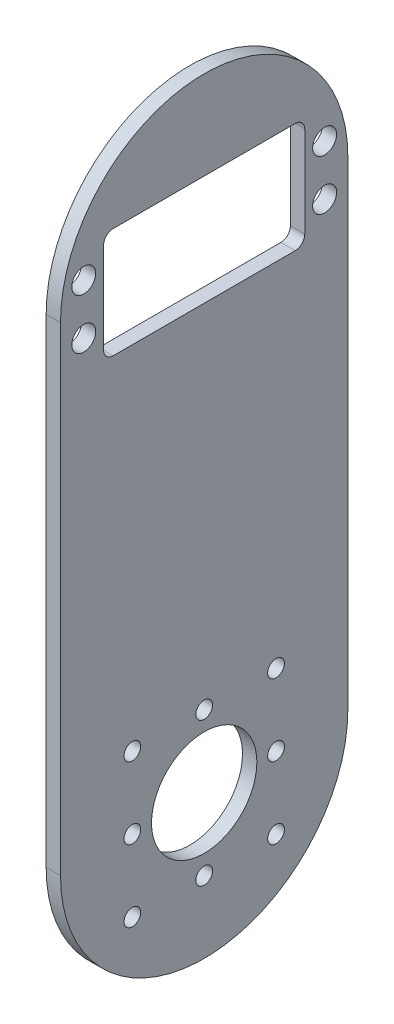
ISO-10303-21;
HEADER;
FILE_DESCRIPTION(('STEP AP214'),'2;1');
FILE_NAME('part.step','',(''),(''),'','','');
FILE_SCHEMA(('AUTOMOTIVE_DESIGN { 1 0 10303 214 1 1 1 1 }'));
ENDSEC;
DATA;
#1=APPLICATION_CONTEXT('core data for automotive mechanical design processes');
#2=APPLICATION_PROTOCOL_DEFINITION('international standard','automotive_design',2000,#1);
#3=PRODUCT_CONTEXT('',#1,'mechanical');
#4=PRODUCT('Part','Part','',(#3));
#5=PRODUCT_RELATED_PRODUCT_CATEGORY('part','',(#4));
#6=PRODUCT_DEFINITION_FORMATION('','',#4);
#7=PRODUCT_DEFINITION_CONTEXT('part definition',#1,'design');
#8=PRODUCT_DEFINITION('design','',#6,#7);
#9=PRODUCT_DEFINITION_SHAPE('','',#8);
#10=(LENGTH_UNIT() NAMED_UNIT(*) SI_UNIT(.MILLI.,.METRE.));
#11=(NAMED_UNIT(*) PLANE_ANGLE_UNIT() SI_UNIT($,.RADIAN.));
#12=(NAMED_UNIT(*) SI_UNIT($,.STERADIAN.) SOLID_ANGLE_UNIT());
#13=UNCERTAINTY_MEASURE_WITH_UNIT(LENGTH_MEASURE(1.E-05),#10,'distance_accuracy_value','');
#14=(GEOMETRIC_REPRESENTATION_CONTEXT(3) GLOBAL_UNCERTAINTY_ASSIGNED_CONTEXT((#13)) GLOBAL_UNIT_ASSIGNED_CONTEXT((#10,
#11,#12)) REPRESENTATION_CONTEXT('',''));
#15=CARTESIAN_POINT('',(0.,0.,0.));
#16=DIRECTION('',(0.,0.,1.));
#17=DIRECTION('',(1.,0.,0.));
#18=AXIS2_PLACEMENT_3D('',#15,#16,#17);
#19=CARTESIAN_POINT('',(3.,0.,-30.));
#20=DIRECTION('',(0.,0.,1.));
#21=DIRECTION('',(1.,0.,0.));
#22=AXIS2_PLACEMENT_3D('',#19,#20,#21);
#23=PLANE('',#22);
#24=DIRECTION('',(0.,1.,0.));
#25=VECTOR('',#24,1.);
#26=CARTESIAN_POINT('',(0.,0.,-30.));
#27=LINE('',#26,#25);
#28=CARTESIAN_POINT('',(0.,-50.,-30.));
#29=VERTEX_POINT('',#28);
#30=CARTESIAN_POINT('',(0.,50.,-29.9999999999999));
#31=VERTEX_POINT('',#30);
#32=EDGE_CURVE('E151',#29,#31,#27,.T.);
#33=ORIENTED_EDGE('',*,*,#32,.T.);
#34=DIRECTION('',(-1.,0.,0.));
#35=VECTOR('',#34,1.);
#36=CARTESIAN_POINT('',(3.00000000000002,50.,-29.9999999999999));
#37=LINE('',#36,#35);
#38=CARTESIAN_POINT('',(3.00000000000002,50.,-29.9999999999999));
#39=VERTEX_POINT('',#38);
#40=EDGE_CURVE('E132',#39,#31,#37,.T.);
#41=ORIENTED_EDGE('',*,*,#40,.F.);
#42=DIRECTION('',(0.,1.,0.));
#43=VECTOR('',#42,1.);
#44=CARTESIAN_POINT('',(3.,0.,-30.));
#45=LINE('',#44,#43);
#46=CARTESIAN_POINT('',(2.99999999999998,-50.,-30.));
#47=VERTEX_POINT('',#46);
#48=EDGE_CURVE('E139',#47,#39,#45,.T.);
#49=ORIENTED_EDGE('',*,*,#48,.F.);
#50=DIRECTION('',(-1.,0.,0.));
#51=VECTOR('',#50,1.);
#52=CARTESIAN_POINT('',(2.99999999999998,-50.,-30.));
#53=LINE('',#52,#51);
#54=EDGE_CURVE('E335',#47,#29,#53,.T.);
#55=ORIENTED_EDGE('',*,*,#54,.T.);
#56=EDGE_LOOP('',(#33,#41,#49,#55));
#57=FACE_BOUND('',#56,.T.);
#58=ADVANCED_FACE('F38',(#57),#23,.F.);
#59=CARTESIAN_POINT('',(3.,49.9999999999999,0.));
#60=DIRECTION('',(-1.,0.,0.));
#61=DIRECTION('',(0.,0.,1.));
#62=AXIS2_PLACEMENT_3D('',#59,#60,#61);
#63=CYLINDRICAL_SURFACE('',#62,30.);
#64=CARTESIAN_POINT('',(0.,50.,0.));
#65=DIRECTION('',(1.,0.,0.));
#66=DIRECTION('',(0.,0.,-1.));
#67=AXIS2_PLACEMENT_3D('',#64,#65,#66);
#68=CIRCLE('',#67,30.);
#69=CARTESIAN_POINT('',(0.,50.,30.));
#70=VERTEX_POINT('',#69);
#71=EDGE_CURVE('E337',#31,#70,#68,.T.);
#72=ORIENTED_EDGE('',*,*,#71,.T.);
#73=DIRECTION('',(-1.,0.,0.));
#74=VECTOR('',#73,1.);
#75=CARTESIAN_POINT('',(2.99999999999998,50.,30.0000000000001));
#76=LINE('',#75,#74);
#77=CARTESIAN_POINT('',(2.99999999999998,50.,30.0000000000001));
#78=VERTEX_POINT('',#77);
#79=EDGE_CURVE('E134',#78,#70,#76,.T.);
#80=ORIENTED_EDGE('',*,*,#79,.F.);
#81=CARTESIAN_POINT('',(3.,49.9999999999999,0.));
#82=DIRECTION('',(1.,0.,0.));
#83=DIRECTION('',(0.,0.,-1.));
#84=AXIS2_PLACEMENT_3D('',#81,#82,#83);
#85=CIRCLE('',#84,30.);
#86=EDGE_CURVE('E127',#39,#78,#85,.T.);
#87=ORIENTED_EDGE('',*,*,#86,.F.);
#88=ORIENTED_EDGE('',*,*,#40,.T.);
#89=EDGE_LOOP('',(#72,#80,#87,#88));
#90=FACE_BOUND('',#89,.T.);
#91=ADVANCED_FACE('F130',(#90),#63,.T.);
#92=CARTESIAN_POINT('',(3.,0.,30.));
#93=DIRECTION('',(0.,0.,1.));
#94=DIRECTION('',(1.,0.,0.));
#95=AXIS2_PLACEMENT_3D('',#92,#93,#94);
#96=PLANE('',#95);
#97=DIRECTION('',(0.,1.,0.));
#98=VECTOR('',#97,1.);
#99=CARTESIAN_POINT('',(0.,0.,30.));
#100=LINE('',#99,#98);
#101=CARTESIAN_POINT('',(0.,-50.,30.0000000000001));
#102=VERTEX_POINT('',#101);
#103=EDGE_CURVE('E339',#102,#70,#100,.T.);
#104=ORIENTED_EDGE('',*,*,#103,.F.);
#105=DIRECTION('',(-1.,0.,0.));
#106=VECTOR('',#105,1.);
#107=CARTESIAN_POINT('',(2.99999999999998,-50.,30.));
#108=LINE('',#107,#106);
#109=CARTESIAN_POINT('',(2.99999999999998,-50.,30.));
#110=VERTEX_POINT('',#109);
#111=EDGE_CURVE('E156',#110,#102,#108,.T.);
#112=ORIENTED_EDGE('',*,*,#111,.F.);
#113=DIRECTION('',(0.,1.,0.));
#114=VECTOR('',#113,1.);
#115=CARTESIAN_POINT('',(3.,0.,30.));
#116=LINE('',#115,#114);
#117=EDGE_CURVE('E138',#110,#78,#116,.T.);
#118=ORIENTED_EDGE('',*,*,#117,.T.);
#119=ORIENTED_EDGE('',*,*,#79,.T.);
#120=EDGE_LOOP('',(#104,#112,#118,#119));
#121=FACE_BOUND('',#120,.T.);
#122=ADVANCED_FACE('F220',(#121),#96,.T.);
#123=CARTESIAN_POINT('',(3.00000000000002,-50.,0.));
#124=DIRECTION('',(-1.,0.,0.));
#125=DIRECTION('',(0.,0.,1.));
#126=AXIS2_PLACEMENT_3D('',#123,#124,#125);
#127=CYLINDRICAL_SURFACE('',#126,30.);
#128=CARTESIAN_POINT('',(0.,-50.,0.));
#129=DIRECTION('',(1.,0.,0.));
#130=DIRECTION('',(0.,0.,-1.));
#131=AXIS2_PLACEMENT_3D('',#128,#129,#130);
#132=CIRCLE('',#131,30.);
#133=EDGE_CURVE('E148',#102,#29,#132,.T.);
#134=ORIENTED_EDGE('',*,*,#133,.T.);
#135=ORIENTED_EDGE('',*,*,#54,.F.);
#136=CARTESIAN_POINT('',(3.00000000000002,-50.,0.));
#137=DIRECTION('',(1.,0.,0.));
#138=DIRECTION('',(0.,0.,-1.));
#139=AXIS2_PLACEMENT_3D('',#136,#137,#138);
#140=CIRCLE('',#139,30.);
#141=EDGE_CURVE('E144',#110,#47,#140,.T.);
#142=ORIENTED_EDGE('',*,*,#141,.F.);
#143=ORIENTED_EDGE('',*,*,#111,.T.);
#144=EDGE_LOOP('',(#134,#135,#142,#143));
#145=FACE_BOUND('',#144,.T.);
#146=ADVANCED_FACE('F345',(#145),#127,.T.);
#147=CARTESIAN_POINT('',(3.,0.,0.));
#148=DIRECTION('',(1.,0.,0.));
#149=DIRECTION('',(0.,0.,-1.));
#150=AXIS2_PLACEMENT_3D('',#147,#148,#149);
#151=PLANE('',#150);
#152=CARTESIAN_POINT('',(2.99999999999999,55.25,25.1500000000001));
#153=DIRECTION('',(1.,0.,0.));
#154=DIRECTION('',(0.,0.,-1.));
#155=AXIS2_PLACEMENT_3D('',#152,#153,#154);
#156=CIRCLE('',#155,2.5);
#157=CARTESIAN_POINT('',(2.99999999999999,55.25,22.6500000000001));
#158=VERTEX_POINT('',#157);
#159=EDGE_CURVE('E267',#158,#158,#156,.T.);
#160=ORIENTED_EDGE('',*,*,#159,.F.);
#161=EDGE_LOOP('',(#160));
#162=FACE_BOUND('',#161,.T.);
#163=CARTESIAN_POINT('',(3.,44.7499999999999,25.15));
#164=DIRECTION('',(1.,0.,0.));
#165=DIRECTION('',(0.,0.,-1.));
#166=AXIS2_PLACEMENT_3D('',#163,#164,#165);
#167=CIRCLE('',#166,2.5);
#168=CARTESIAN_POINT('',(3.,44.7499999999999,22.65));
#169=VERTEX_POINT('',#168);
#170=EDGE_CURVE('E261',#169,#169,#167,.T.);
#171=ORIENTED_EDGE('',*,*,#170,.F.);
#172=EDGE_LOOP('',(#171));
#173=FACE_BOUND('',#172,.T.);
#174=DIRECTION('',(0.,-1.,0.));
#175=VECTOR('',#174,1.);
#176=CARTESIAN_POINT('',(3.00000000000003,38.4999999999999,21.));
#177=LINE('',#176,#175);
#178=CARTESIAN_POINT('',(3.,59.4999999999999,21.));
#179=VERTEX_POINT('',#178);
#180=CARTESIAN_POINT('',(3.,40.4999999999999,21.));
#181=VERTEX_POINT('',#180);
#182=EDGE_CURVE('E246',#179,#181,#177,.T.);
#183=ORIENTED_EDGE('',*,*,#182,.F.);
#184=CARTESIAN_POINT('',(3.00000000000004,59.5000000000001,19.0000000000001));
#185=DIRECTION('',(1.,0.,0.));
#186=DIRECTION('',(0.,0.,-1.));
#187=AXIS2_PLACEMENT_3D('',#184,#185,#186);
#188=CIRCLE('',#187,2.);
#189=CARTESIAN_POINT('',(2.99999999999999,61.4999999999999,19.));
#190=VERTEX_POINT('',#189);
#191=EDGE_CURVE('E176',#179,#190,#188,.F.);
#192=ORIENTED_EDGE('',*,*,#191,.T.);
#193=DIRECTION('',(0.,0.,1.));
#194=VECTOR('',#193,1.);
#195=CARTESIAN_POINT('',(3.,61.4999999999999,-21.));
#196=LINE('',#195,#194);
#197=CARTESIAN_POINT('',(3.,61.4999999999999,-19.));
#198=VERTEX_POINT('',#197);
#199=EDGE_CURVE('E256',#198,#190,#196,.T.);
#200=ORIENTED_EDGE('',*,*,#199,.F.);
#201=CARTESIAN_POINT('',(2.99999999999998,59.4999999999999,-19.));
#202=DIRECTION('',(1.,0.,0.));
#203=DIRECTION('',(0.,0.,-1.));
#204=AXIS2_PLACEMENT_3D('',#201,#202,#203);
#205=CIRCLE('',#204,2.);
#206=CARTESIAN_POINT('',(3.,59.4999999999999,-21.));
#207=VERTEX_POINT('',#206);
#208=EDGE_CURVE('E46',#198,#207,#205,.F.);
#209=ORIENTED_EDGE('',*,*,#208,.T.);
#210=DIRECTION('',(0.,1.,0.));
#211=VECTOR('',#210,1.);
#212=CARTESIAN_POINT('',(3.,38.5,-21.));
#213=LINE('',#212,#211);
#214=CARTESIAN_POINT('',(3.,40.4999999999999,-21.));
#215=VERTEX_POINT('',#214);
#216=EDGE_CURVE('E254',#215,#207,#213,.T.);
#217=ORIENTED_EDGE('',*,*,#216,.F.);
#218=CARTESIAN_POINT('',(3.,40.4999999999999,-19.));
#219=DIRECTION('',(1.,0.,0.));
#220=DIRECTION('',(0.,0.,-1.));
#221=AXIS2_PLACEMENT_3D('',#218,#219,#220);
#222=CIRCLE('',#221,2.);
#223=CARTESIAN_POINT('',(2.99999999999999,38.5,-19.));
#224=VERTEX_POINT('',#223);
#225=EDGE_CURVE('E60',#215,#224,#222,.F.);
#226=ORIENTED_EDGE('',*,*,#225,.T.);
#227=DIRECTION('',(0.,0.,-1.));
#228=VECTOR('',#227,1.);
#229=CARTESIAN_POINT('',(3.,38.5,-21.));
#230=LINE('',#229,#228);
#231=CARTESIAN_POINT('',(3.00000000000004,38.5,19.));
#232=VERTEX_POINT('',#231);
#233=EDGE_CURVE('E248',#232,#224,#230,.T.);
#234=ORIENTED_EDGE('',*,*,#233,.F.);
#235=CARTESIAN_POINT('',(3.00000000000003,40.5,19.));
#236=DIRECTION('',(1.,0.,0.));
#237=DIRECTION('',(0.,0.,-1.));
#238=AXIS2_PLACEMENT_3D('',#235,#236,#237);
#239=CIRCLE('',#238,2.);
#240=EDGE_CURVE('E180',#232,#181,#239,.F.);
#241=ORIENTED_EDGE('',*,*,#240,.T.);
#242=EDGE_LOOP('',(#183,#192,#200,#209,#217,#226,#234,#241));
#243=FACE_BOUND('',#242,.T.);
#244=CARTESIAN_POINT('',(3.00000000000002,44.75,-25.1499999999999));
#245=DIRECTION('',(1.,0.,0.));
#246=DIRECTION('',(0.,0.,-1.));
#247=AXIS2_PLACEMENT_3D('',#244,#245,#246);
#248=CIRCLE('',#247,2.5);
#249=CARTESIAN_POINT('',(3.00000000000002,44.75,-27.6499999999999));
#250=VERTEX_POINT('',#249);
#251=EDGE_CURVE('E260',#250,#250,#248,.T.);
#252=ORIENTED_EDGE('',*,*,#251,.F.);
#253=EDGE_LOOP('',(#252));
#254=FACE_BOUND('',#253,.T.);
#255=CARTESIAN_POINT('',(3.00000000000003,55.25,-25.15));
#256=DIRECTION('',(1.,0.,0.));
#257=DIRECTION('',(0.,0.,-1.));
#258=AXIS2_PLACEMENT_3D('',#255,#256,#257);
#259=CIRCLE('',#258,2.5);
#260=CARTESIAN_POINT('',(3.00000000000003,55.25,-27.65));
#261=VERTEX_POINT('',#260);
#262=EDGE_CURVE('E272',#261,#261,#259,.T.);
#263=ORIENTED_EDGE('',*,*,#262,.F.);
#264=EDGE_LOOP('',(#263));
#265=FACE_BOUND('',#264,.T.);
#266=CARTESIAN_POINT('',(2.99999999999999,-35.,0.));
#267=DIRECTION('',(1.,0.,0.));
#268=DIRECTION('',(0.,0.,-1.));
#269=AXIS2_PLACEMENT_3D('',#266,#267,#268);
#270=CIRCLE('',#269,1.75);
#271=CARTESIAN_POINT('',(2.99999999999999,-35.,-1.74999999999999));
#272=VERTEX_POINT('',#271);
#273=EDGE_CURVE('E307',#272,#272,#270,.T.);
#274=ORIENTED_EDGE('',*,*,#273,.F.);
#275=EDGE_LOOP('',(#274));
#276=FACE_BOUND('',#275,.T.);
#277=CARTESIAN_POINT('',(3.,-35.0000000000001,15.));
#278=DIRECTION('',(1.,0.,0.));
#279=DIRECTION('',(0.,0.,-1.));
#280=AXIS2_PLACEMENT_3D('',#277,#278,#279);
#281=CIRCLE('',#280,1.75);
#282=CARTESIAN_POINT('',(3.,-35.0000000000001,13.25));
#283=VERTEX_POINT('',#282);
#284=EDGE_CURVE('E308',#283,#283,#281,.T.);
#285=ORIENTED_EDGE('',*,*,#284,.F.);
#286=EDGE_LOOP('',(#285));
#287=FACE_BOUND('',#286,.T.);
#288=CARTESIAN_POINT('',(3.,-50.,-14.9999999999999));
#289=DIRECTION('',(1.,0.,0.));
#290=DIRECTION('',(0.,0.,-1.));
#291=AXIS2_PLACEMENT_3D('',#288,#289,#290);
#292=CIRCLE('',#291,1.75);
#293=CARTESIAN_POINT('',(3.,-50.,-16.7499999999999));
#294=VERTEX_POINT('',#293);
#295=EDGE_CURVE('E315',#294,#294,#292,.T.);
#296=ORIENTED_EDGE('',*,*,#295,.F.);
#297=EDGE_LOOP('',(#296));
#298=FACE_BOUND('',#297,.T.);
#299=CARTESIAN_POINT('',(3.00000000000003,-65.,0.));
#300=DIRECTION('',(1.,0.,0.));
#301=DIRECTION('',(0.,0.,-1.));
#302=AXIS2_PLACEMENT_3D('',#299,#300,#301);
#303=CIRCLE('',#302,1.75);
#304=CARTESIAN_POINT('',(3.00000000000003,-65.,-1.74999999999997));
#305=VERTEX_POINT('',#304);
#306=EDGE_CURVE('E321',#305,#305,#303,.T.);
#307=ORIENTED_EDGE('',*,*,#306,.F.);
#308=EDGE_LOOP('',(#307));
#309=FACE_BOUND('',#308,.T.);
#310=CARTESIAN_POINT('',(3.00000000000002,-50.,14.9999999999999));
#311=DIRECTION('',(1.,0.,0.));
#312=DIRECTION('',(0.,0.,-1.));
#313=AXIS2_PLACEMENT_3D('',#310,#311,#312);
#314=CIRCLE('',#313,1.75);
#315=CARTESIAN_POINT('',(3.00000000000002,-50.,13.2499999999999));
#316=VERTEX_POINT('',#315);
#317=EDGE_CURVE('E283',#316,#316,#314,.T.);
#318=ORIENTED_EDGE('',*,*,#317,.F.);
#319=EDGE_LOOP('',(#318));
#320=FACE_BOUND('',#319,.T.);
#321=CARTESIAN_POINT('',(3.00000000000002,-65.,15.));
#322=DIRECTION('',(1.,0.,0.));
#323=DIRECTION('',(0.,0.,-1.));
#324=AXIS2_PLACEMENT_3D('',#321,#322,#323);
#325=CIRCLE('',#324,1.75);
#326=CARTESIAN_POINT('',(3.00000000000002,-65.,13.25));
#327=VERTEX_POINT('',#326);
#328=EDGE_CURVE('E284',#327,#327,#325,.T.);
#329=ORIENTED_EDGE('',*,*,#328,.F.);
#330=EDGE_LOOP('',(#329));
#331=FACE_BOUND('',#330,.T.);
#332=CARTESIAN_POINT('',(2.99999999999998,-65.,-15.));
#333=DIRECTION('',(1.,0.,0.));
#334=DIRECTION('',(0.,0.,-1.));
#335=AXIS2_PLACEMENT_3D('',#332,#333,#334);
#336=CIRCLE('',#335,1.75);
#337=CARTESIAN_POINT('',(2.99999999999998,-65.,-16.75));
#338=VERTEX_POINT('',#337);
#339=EDGE_CURVE('E291',#338,#338,#336,.T.);
#340=ORIENTED_EDGE('',*,*,#339,.F.);
#341=EDGE_LOOP('',(#340));
#342=FACE_BOUND('',#341,.T.);
#343=CARTESIAN_POINT('',(3.00000000000002,-50.,0.));
#344=DIRECTION('',(1.,0.,0.));
#345=DIRECTION('',(0.,0.,-1.));
#346=AXIS2_PLACEMENT_3D('',#343,#344,#345);
#347=CIRCLE('',#346,11.);
#348=CARTESIAN_POINT('',(3.00000000000002,-50.,-11.));
#349=VERTEX_POINT('',#348);
#350=EDGE_CURVE('E297',#349,#349,#347,.T.);
#351=ORIENTED_EDGE('',*,*,#350,.F.);
#352=EDGE_LOOP('',(#351));
#353=FACE_BOUND('',#352,.T.);
#354=CARTESIAN_POINT('',(3.,-35.,-15.));
#355=DIRECTION('',(1.,0.,0.));
#356=DIRECTION('',(0.,0.,-1.));
#357=AXIS2_PLACEMENT_3D('',#354,#355,#356);
#358=CIRCLE('',#357,1.75);
#359=CARTESIAN_POINT('',(3.,-35.,-16.75));
#360=VERTEX_POINT('',#359);
#361=EDGE_CURVE('E311',#360,#360,#358,.T.);
#362=ORIENTED_EDGE('',*,*,#361,.F.);
#363=EDGE_LOOP('',(#362));
#364=FACE_BOUND('',#363,.T.);
#365=ORIENTED_EDGE('',*,*,#48,.T.);
#366=ORIENTED_EDGE('',*,*,#86,.T.);
#367=ORIENTED_EDGE('',*,*,#117,.F.);
#368=ORIENTED_EDGE('',*,*,#141,.T.);
#369=EDGE_LOOP('',(#365,#366,#367,#368));
#370=FACE_BOUND('',#369,.T.);
#371=ADVANCED_FACE('F142',(#162,#173,#243,#254,#265,#276,#287,#298,#309,#320,#331,#342,#353,
#364,#370),#151,.T.);
#372=CARTESIAN_POINT('',(0.,0.,0.));
#373=DIRECTION('',(1.,0.,0.));
#374=DIRECTION('',(0.,0.,-1.));
#375=AXIS2_PLACEMENT_3D('',#372,#373,#374);
#376=PLANE('',#375);
#377=CARTESIAN_POINT('',(0.,55.25,25.1500000000001));
#378=DIRECTION('',(1.,0.,0.));
#379=DIRECTION('',(0.,0.,-1.));
#380=AXIS2_PLACEMENT_3D('',#377,#378,#379);
#381=CIRCLE('',#380,2.5);
#382=CARTESIAN_POINT('',(0.,55.25,22.6500000000001));
#383=VERTEX_POINT('',#382);
#384=EDGE_CURVE('E264',#383,#383,#381,.F.);
#385=ORIENTED_EDGE('',*,*,#384,.F.);
#386=EDGE_LOOP('',(#385));
#387=FACE_BOUND('',#386,.T.);
#388=CARTESIAN_POINT('',(0.,44.75,25.15));
#389=DIRECTION('',(1.,0.,0.));
#390=DIRECTION('',(0.,0.,-1.));
#391=AXIS2_PLACEMENT_3D('',#388,#389,#390);
#392=CIRCLE('',#391,2.5);
#393=CARTESIAN_POINT('',(0.,44.75,22.65));
#394=VERTEX_POINT('',#393);
#395=EDGE_CURVE('E202',#394,#394,#392,.F.);
#396=ORIENTED_EDGE('',*,*,#395,.F.);
#397=EDGE_LOOP('',(#396));
#398=FACE_BOUND('',#397,.T.);
#399=DIRECTION('',(0.,0.,-1.));
#400=VECTOR('',#399,1.);
#401=CARTESIAN_POINT('',(0.,61.5,-21.));
#402=LINE('',#401,#400);
#403=CARTESIAN_POINT('',(0.,61.4999999999999,19.));
#404=VERTEX_POINT('',#403);
#405=CARTESIAN_POINT('',(0.,61.4999999999999,-19.));
#406=VERTEX_POINT('',#405);
#407=EDGE_CURVE('E201',#404,#406,#402,.T.);
#408=ORIENTED_EDGE('',*,*,#407,.F.);
#409=CARTESIAN_POINT('',(0.,59.5,19.));
#410=DIRECTION('',(1.,0.,0.));
#411=DIRECTION('',(0.,0.,-1.));
#412=AXIS2_PLACEMENT_3D('',#409,#410,#411);
#413=CIRCLE('',#412,2.);
#414=CARTESIAN_POINT('',(0.,59.5,21.));
#415=VERTEX_POINT('',#414);
#416=EDGE_CURVE('E178',#404,#415,#413,.T.);
#417=ORIENTED_EDGE('',*,*,#416,.T.);
#418=DIRECTION('',(0.,1.,0.));
#419=VECTOR('',#418,1.);
#420=CARTESIAN_POINT('',(0.,38.5,21.));
#421=LINE('',#420,#419);
#422=CARTESIAN_POINT('',(0.,40.4999999999999,21.));
#423=VERTEX_POINT('',#422);
#424=EDGE_CURVE('E238',#423,#415,#421,.T.);
#425=ORIENTED_EDGE('',*,*,#424,.F.);
#426=CARTESIAN_POINT('',(0.,40.4999999999999,19.));
#427=DIRECTION('',(1.,0.,0.));
#428=DIRECTION('',(0.,0.,-1.));
#429=AXIS2_PLACEMENT_3D('',#426,#427,#428);
#430=CIRCLE('',#429,2.);
#431=CARTESIAN_POINT('',(0.,38.5,19.));
#432=VERTEX_POINT('',#431);
#433=EDGE_CURVE('E182',#423,#432,#430,.T.);
#434=ORIENTED_EDGE('',*,*,#433,.T.);
#435=DIRECTION('',(0.,0.,1.));
#436=VECTOR('',#435,1.);
#437=CARTESIAN_POINT('',(0.,38.5,-21.));
#438=LINE('',#437,#436);
#439=CARTESIAN_POINT('',(0.,38.5,-19.));
#440=VERTEX_POINT('',#439);
#441=EDGE_CURVE('E197',#440,#432,#438,.T.);
#442=ORIENTED_EDGE('',*,*,#441,.F.);
#443=CARTESIAN_POINT('',(0.,40.4999999999999,-19.));
#444=DIRECTION('',(1.,0.,0.));
#445=DIRECTION('',(0.,0.,-1.));
#446=AXIS2_PLACEMENT_3D('',#443,#444,#445);
#447=CIRCLE('',#446,2.);
#448=CARTESIAN_POINT('',(0.,40.4999999999999,-21.));
#449=VERTEX_POINT('',#448);
#450=EDGE_CURVE('E185',#440,#449,#447,.T.);
#451=ORIENTED_EDGE('',*,*,#450,.T.);
#452=DIRECTION('',(0.,-1.,0.));
#453=VECTOR('',#452,1.);
#454=CARTESIAN_POINT('',(0.,38.5,-21.));
#455=LINE('',#454,#453);
#456=CARTESIAN_POINT('',(0.,59.4999999999999,-21.));
#457=VERTEX_POINT('',#456);
#458=EDGE_CURVE('E194',#457,#449,#455,.T.);
#459=ORIENTED_EDGE('',*,*,#458,.F.);
#460=CARTESIAN_POINT('',(0.,59.4999999999999,-18.9999999999999));
#461=DIRECTION('',(1.,0.,0.));
#462=DIRECTION('',(0.,0.,-1.));
#463=AXIS2_PLACEMENT_3D('',#460,#461,#462);
#464=CIRCLE('',#463,2.);
#465=EDGE_CURVE('E11',#457,#406,#464,.T.);
#466=ORIENTED_EDGE('',*,*,#465,.T.);
#467=EDGE_LOOP('',(#408,#417,#425,#434,#442,#451,#459,#466));
#468=FACE_BOUND('',#467,.T.);
#469=CARTESIAN_POINT('',(0.,44.7499999999999,-25.15));
#470=DIRECTION('',(1.,0.,0.));
#471=DIRECTION('',(0.,0.,-1.));
#472=AXIS2_PLACEMENT_3D('',#469,#470,#471);
#473=CIRCLE('',#472,2.5);
#474=CARTESIAN_POINT('',(0.,44.7499999999999,-27.65));
#475=VERTEX_POINT('',#474);
#476=EDGE_CURVE('E276',#475,#475,#473,.F.);
#477=ORIENTED_EDGE('',*,*,#476,.F.);
#478=EDGE_LOOP('',(#477));
#479=FACE_BOUND('',#478,.T.);
#480=CARTESIAN_POINT('',(0.,55.25,-25.15));
#481=DIRECTION('',(1.,0.,0.));
#482=DIRECTION('',(0.,0.,-1.));
#483=AXIS2_PLACEMENT_3D('',#480,#481,#482);
#484=CIRCLE('',#483,2.5);
#485=CARTESIAN_POINT('',(0.,55.25,-27.65));
#486=VERTEX_POINT('',#485);
#487=EDGE_CURVE('E275',#486,#486,#484,.F.);
#488=ORIENTED_EDGE('',*,*,#487,.F.);
#489=EDGE_LOOP('',(#488));
#490=FACE_BOUND('',#489,.T.);
#491=CARTESIAN_POINT('',(0.,-35.,0.));
#492=DIRECTION('',(1.,0.,0.));
#493=DIRECTION('',(0.,0.,-1.));
#494=AXIS2_PLACEMENT_3D('',#491,#492,#493);
#495=CIRCLE('',#494,1.75);
#496=CARTESIAN_POINT('',(0.,-35.,-1.74999999999996));
#497=VERTEX_POINT('',#496);
#498=EDGE_CURVE('E304',#497,#497,#495,.F.);
#499=ORIENTED_EDGE('',*,*,#498,.F.);
#500=EDGE_LOOP('',(#499));
#501=FACE_BOUND('',#500,.T.);
#502=CARTESIAN_POINT('',(0.,-35.,15.));
#503=DIRECTION('',(1.,0.,0.));
#504=DIRECTION('',(0.,0.,-1.));
#505=AXIS2_PLACEMENT_3D('',#502,#503,#504);
#506=CIRCLE('',#505,1.75);
#507=CARTESIAN_POINT('',(0.,-35.,13.25));
#508=VERTEX_POINT('',#507);
#509=EDGE_CURVE('E312',#508,#508,#506,.F.);
#510=ORIENTED_EDGE('',*,*,#509,.F.);
#511=EDGE_LOOP('',(#510));
#512=FACE_BOUND('',#511,.T.);
#513=CARTESIAN_POINT('',(0.,-50.,-14.9999999999999));
#514=DIRECTION('',(1.,0.,0.));
#515=DIRECTION('',(0.,0.,-1.));
#516=AXIS2_PLACEMENT_3D('',#513,#514,#515);
#517=CIRCLE('',#516,1.75);
#518=CARTESIAN_POINT('',(0.,-50.,-16.7499999999999));
#519=VERTEX_POINT('',#518);
#520=EDGE_CURVE('E318',#519,#519,#517,.F.);
#521=ORIENTED_EDGE('',*,*,#520,.F.);
#522=EDGE_LOOP('',(#521));
#523=FACE_BOUND('',#522,.T.);
#524=CARTESIAN_POINT('',(0.,-65.,0.));
#525=DIRECTION('',(1.,0.,0.));
#526=DIRECTION('',(0.,0.,-1.));
#527=AXIS2_PLACEMENT_3D('',#524,#525,#526);
#528=CIRCLE('',#527,1.75);
#529=CARTESIAN_POINT('',(0.,-65.,-1.74999999999997));
#530=VERTEX_POINT('',#529);
#531=EDGE_CURVE('E287',#530,#530,#528,.F.);
#532=ORIENTED_EDGE('',*,*,#531,.F.);
#533=EDGE_LOOP('',(#532));
#534=FACE_BOUND('',#533,.T.);
#535=CARTESIAN_POINT('',(0.,-50.,15.));
#536=DIRECTION('',(1.,0.,0.));
#537=DIRECTION('',(0.,0.,-1.));
#538=AXIS2_PLACEMENT_3D('',#535,#536,#537);
#539=CIRCLE('',#538,1.75);
#540=CARTESIAN_POINT('',(0.,-50.,13.25));
#541=VERTEX_POINT('',#540);
#542=EDGE_CURVE('E280',#541,#541,#539,.F.);
#543=ORIENTED_EDGE('',*,*,#542,.F.);
#544=EDGE_LOOP('',(#543));
#545=FACE_BOUND('',#544,.T.);
#546=CARTESIAN_POINT('',(0.,-65.,14.9999999999999));
#547=DIRECTION('',(1.,0.,0.));
#548=DIRECTION('',(0.,0.,-1.));
#549=AXIS2_PLACEMENT_3D('',#546,#547,#548);
#550=CIRCLE('',#549,1.75);
#551=CARTESIAN_POINT('',(0.,-65.,13.2499999999999));
#552=VERTEX_POINT('',#551);
#553=EDGE_CURVE('E288',#552,#552,#550,.F.);
#554=ORIENTED_EDGE('',*,*,#553,.F.);
#555=EDGE_LOOP('',(#554));
#556=FACE_BOUND('',#555,.T.);
#557=CARTESIAN_POINT('',(0.,-65.,-15.));
#558=DIRECTION('',(1.,0.,0.));
#559=DIRECTION('',(0.,0.,-1.));
#560=AXIS2_PLACEMENT_3D('',#557,#558,#559);
#561=CIRCLE('',#560,1.75);
#562=CARTESIAN_POINT('',(0.,-65.,-16.75));
#563=VERTEX_POINT('',#562);
#564=EDGE_CURVE('E294',#563,#563,#561,.F.);
#565=ORIENTED_EDGE('',*,*,#564,.F.);
#566=EDGE_LOOP('',(#565));
#567=FACE_BOUND('',#566,.T.);
#568=CARTESIAN_POINT('',(0.,-50.,0.));
#569=DIRECTION('',(1.,0.,0.));
#570=DIRECTION('',(0.,0.,-1.));
#571=AXIS2_PLACEMENT_3D('',#568,#569,#570);
#572=CIRCLE('',#571,11.);
#573=CARTESIAN_POINT('',(0.,-50.,-11.));
#574=VERTEX_POINT('',#573);
#575=EDGE_CURVE('E279',#574,#574,#572,.F.);
#576=ORIENTED_EDGE('',*,*,#575,.F.);
#577=EDGE_LOOP('',(#576));
#578=FACE_BOUND('',#577,.T.);
#579=CARTESIAN_POINT('',(0.,-35.,-14.9999999999999));
#580=DIRECTION('',(1.,0.,0.));
#581=DIRECTION('',(0.,0.,-1.));
#582=AXIS2_PLACEMENT_3D('',#579,#580,#581);
#583=CIRCLE('',#582,1.75);
#584=CARTESIAN_POINT('',(0.,-35.,-16.7499999999999));
#585=VERTEX_POINT('',#584);
#586=EDGE_CURVE('E330',#585,#585,#583,.F.);
#587=ORIENTED_EDGE('',*,*,#586,.F.);
#588=EDGE_LOOP('',(#587));
#589=FACE_BOUND('',#588,.T.);
#590=ORIENTED_EDGE('',*,*,#32,.F.);
#591=ORIENTED_EDGE('',*,*,#133,.F.);
#592=ORIENTED_EDGE('',*,*,#103,.T.);
#593=ORIENTED_EDGE('',*,*,#71,.F.);
#594=EDGE_LOOP('',(#590,#591,#592,#593));
#595=FACE_BOUND('',#594,.T.);
#596=ADVANCED_FACE('F192',(#387,#398,#468,#479,#490,#501,#512,#523,#534,#545,#556,#567,#578,
#589,#595),#376,.F.);
#597=CARTESIAN_POINT('',(-0.00100000000001488,-35.,-15.));
#598=DIRECTION('',(1.,0.,0.));
#599=DIRECTION('',(0.,0.,-1.));
#600=AXIS2_PLACEMENT_3D('',#597,#598,#599);
#601=CYLINDRICAL_SURFACE('',#600,1.75);
#602=ORIENTED_EDGE('',*,*,#361,.T.);
#603=EDGE_LOOP('',(#602));
#604=FACE_BOUND('',#603,.T.);
#605=ORIENTED_EDGE('',*,*,#586,.T.);
#606=EDGE_LOOP('',(#605));
#607=FACE_BOUND('',#606,.T.);
#608=ADVANCED_FACE('F357',(#604,#607),#601,.F.);
#609=CARTESIAN_POINT('',(-0.000999999999987122,-50.,0.));
#610=DIRECTION('',(1.,0.,0.));
#611=DIRECTION('',(0.,0.,-1.));
#612=AXIS2_PLACEMENT_3D('',#609,#610,#611);
#613=CYLINDRICAL_SURFACE('',#612,11.);
#614=ORIENTED_EDGE('',*,*,#350,.T.);
#615=EDGE_LOOP('',(#614));
#616=FACE_BOUND('',#615,.T.);
#617=ORIENTED_EDGE('',*,*,#575,.T.);
#618=EDGE_LOOP('',(#617));
#619=FACE_BOUND('',#618,.T.);
#620=ADVANCED_FACE('F364',(#616,#619),#613,.F.);
#621=CARTESIAN_POINT('',(-0.00100000000001488,-65.,-15.));
#622=DIRECTION('',(1.,0.,0.));
#623=DIRECTION('',(0.,0.,-1.));
#624=AXIS2_PLACEMENT_3D('',#621,#622,#623);
#625=CYLINDRICAL_SURFACE('',#624,1.75);
#626=ORIENTED_EDGE('',*,*,#339,.T.);
#627=EDGE_LOOP('',(#626));
#628=FACE_BOUND('',#627,.T.);
#629=ORIENTED_EDGE('',*,*,#564,.T.);
#630=EDGE_LOOP('',(#629));
#631=FACE_BOUND('',#630,.T.);
#632=ADVANCED_FACE('F386',(#628,#631),#625,.F.);
#633=CARTESIAN_POINT('',(-0.000999999999973245,-65.,15.));
#634=DIRECTION('',(1.,0.,0.));
#635=DIRECTION('',(0.,0.,-1.));
#636=AXIS2_PLACEMENT_3D('',#633,#634,#635);
#637=CYLINDRICAL_SURFACE('',#636,1.75);
#638=ORIENTED_EDGE('',*,*,#328,.T.);
#639=EDGE_LOOP('',(#638));
#640=FACE_BOUND('',#639,.T.);
#641=ORIENTED_EDGE('',*,*,#553,.T.);
#642=EDGE_LOOP('',(#641));
#643=FACE_BOUND('',#642,.T.);
#644=ADVANCED_FACE('F390',(#640,#643),#637,.F.);
#645=CARTESIAN_POINT('',(-0.000999999999987122,-50.,15.));
#646=DIRECTION('',(1.,0.,0.));
#647=DIRECTION('',(0.,0.,-1.));
#648=AXIS2_PLACEMENT_3D('',#645,#646,#647);
#649=CYLINDRICAL_SURFACE('',#648,1.75);
#650=ORIENTED_EDGE('',*,*,#317,.T.);
#651=EDGE_LOOP('',(#650));
#652=FACE_BOUND('',#651,.T.);
#653=ORIENTED_EDGE('',*,*,#542,.T.);
#654=EDGE_LOOP('',(#653));
#655=FACE_BOUND('',#654,.T.);
#656=ADVANCED_FACE('F370',(#652,#655),#649,.F.);
#657=CARTESIAN_POINT('',(-0.000999999999973245,-65.,0.));
#658=DIRECTION('',(1.,0.,0.));
#659=DIRECTION('',(0.,0.,-1.));
#660=AXIS2_PLACEMENT_3D('',#657,#658,#659);
#661=CYLINDRICAL_SURFACE('',#660,1.75);
#662=ORIENTED_EDGE('',*,*,#306,.T.);
#663=EDGE_LOOP('',(#662));
#664=FACE_BOUND('',#663,.T.);
#665=ORIENTED_EDGE('',*,*,#531,.T.);
#666=EDGE_LOOP('',(#665));
#667=FACE_BOUND('',#666,.T.);
#668=ADVANCED_FACE('F366',(#664,#667),#661,.F.);
#669=CARTESIAN_POINT('',(-0.001000000000001,-50.,-14.9999999999999));
#670=DIRECTION('',(1.,0.,0.));
#671=DIRECTION('',(0.,0.,-1.));
#672=AXIS2_PLACEMENT_3D('',#669,#670,#671);
#673=CYLINDRICAL_SURFACE('',#672,1.75);
#674=ORIENTED_EDGE('',*,*,#295,.T.);
#675=EDGE_LOOP('',(#674));
#676=FACE_BOUND('',#675,.T.);
#677=ORIENTED_EDGE('',*,*,#520,.T.);
#678=EDGE_LOOP('',(#677));
#679=FACE_BOUND('',#678,.T.);
#680=ADVANCED_FACE('F369',(#676,#679),#673,.F.);
#681=CARTESIAN_POINT('',(-0.000999999999987122,-35.,15.0000000000001));
#682=DIRECTION('',(1.,0.,0.));
#683=DIRECTION('',(0.,0.,-1.));
#684=AXIS2_PLACEMENT_3D('',#681,#682,#683);
#685=CYLINDRICAL_SURFACE('',#684,1.75);
#686=ORIENTED_EDGE('',*,*,#284,.T.);
#687=EDGE_LOOP('',(#686));
#688=FACE_BOUND('',#687,.T.);
#689=ORIENTED_EDGE('',*,*,#509,.T.);
#690=EDGE_LOOP('',(#689));
#691=FACE_BOUND('',#690,.T.);
#692=ADVANCED_FACE('F374',(#688,#691),#685,.F.);
#693=CARTESIAN_POINT('',(-0.001000000000001,-35.,0.));
#694=DIRECTION('',(1.,0.,0.));
#695=DIRECTION('',(0.,0.,-1.));
#696=AXIS2_PLACEMENT_3D('',#693,#694,#695);
#697=CYLINDRICAL_SURFACE('',#696,1.75);
#698=ORIENTED_EDGE('',*,*,#273,.T.);
#699=EDGE_LOOP('',(#698));
#700=FACE_BOUND('',#699,.T.);
#701=ORIENTED_EDGE('',*,*,#498,.T.);
#702=EDGE_LOOP('',(#701));
#703=FACE_BOUND('',#702,.T.);
#704=ADVANCED_FACE('F378',(#700,#703),#697,.F.);
#705=CARTESIAN_POINT('',(-0.001000000000001,55.25,-25.15));
#706=DIRECTION('',(1.,0.,0.));
#707=DIRECTION('',(0.,0.,-1.));
#708=AXIS2_PLACEMENT_3D('',#705,#706,#707);
#709=CYLINDRICAL_SURFACE('',#708,2.5);
#710=ORIENTED_EDGE('',*,*,#262,.T.);
#711=EDGE_LOOP('',(#710));
#712=FACE_BOUND('',#711,.T.);
#713=ORIENTED_EDGE('',*,*,#487,.T.);
#714=EDGE_LOOP('',(#713));
#715=FACE_BOUND('',#714,.T.);
#716=ADVANCED_FACE('F382',(#712,#715),#709,.F.);
#717=CARTESIAN_POINT('',(-0.001000000000001,44.7499999999999,-25.15));
#718=DIRECTION('',(1.,0.,0.));
#719=DIRECTION('',(0.,0.,-1.));
#720=AXIS2_PLACEMENT_3D('',#717,#718,#719);
#721=CYLINDRICAL_SURFACE('',#720,2.5);
#722=ORIENTED_EDGE('',*,*,#251,.T.);
#723=EDGE_LOOP('',(#722));
#724=FACE_BOUND('',#723,.T.);
#725=ORIENTED_EDGE('',*,*,#476,.T.);
#726=EDGE_LOOP('',(#725));
#727=FACE_BOUND('',#726,.T.);
#728=ADVANCED_FACE('F399',(#724,#727),#721,.F.);
#729=CARTESIAN_POINT('',(-0.000999999999973245,38.5,21.));
#730=DIRECTION('',(0.,0.,1.));
#731=DIRECTION('',(1.,0.,0.));
#732=AXIS2_PLACEMENT_3D('',#729,#730,#731);
#733=PLANE('',#732);
#734=ORIENTED_EDGE('',*,*,#424,.T.);
#735=DIRECTION('',(1.,0.,0.));
#736=VECTOR('',#735,1.);
#737=CARTESIAN_POINT('',(3.,59.4999999999999,21.));
#738=LINE('',#737,#736);
#739=EDGE_CURVE('E154',#415,#179,#738,.T.);
#740=ORIENTED_EDGE('',*,*,#739,.T.);
#741=ORIENTED_EDGE('',*,*,#182,.T.);
#742=DIRECTION('',(1.,0.,0.));
#743=VECTOR('',#742,1.);
#744=CARTESIAN_POINT('',(0.,40.4999999999999,21.));
#745=LINE('',#744,#743);
#746=EDGE_CURVE('E152',#181,#423,#745,.F.);
#747=ORIENTED_EDGE('',*,*,#746,.T.);
#748=EDGE_LOOP('',(#734,#740,#741,#747));
#749=FACE_BOUND('',#748,.T.);
#750=ADVANCED_FACE('F242',(#749),#733,.F.);
#751=CARTESIAN_POINT('',(-0.000999999999987122,61.5,-21.));
#752=DIRECTION('',(0.,1.,0.));
#753=DIRECTION('',(0.,0.,1.));
#754=AXIS2_PLACEMENT_3D('',#751,#752,#753);
#755=PLANE('',#754);
#756=ORIENTED_EDGE('',*,*,#199,.T.);
#757=DIRECTION('',(1.,0.,0.));
#758=VECTOR('',#757,1.);
#759=CARTESIAN_POINT('',(0.,61.4999999999999,19.));
#760=LINE('',#759,#758);
#761=EDGE_CURVE('E165',#190,#404,#760,.F.);
#762=ORIENTED_EDGE('',*,*,#761,.T.);
#763=ORIENTED_EDGE('',*,*,#407,.T.);
#764=DIRECTION('',(1.,0.,0.));
#765=VECTOR('',#764,1.);
#766=CARTESIAN_POINT('',(3.,61.4999999999999,-19.));
#767=LINE('',#766,#765);
#768=EDGE_CURVE('E162',#406,#198,#767,.T.);
#769=ORIENTED_EDGE('',*,*,#768,.T.);
#770=EDGE_LOOP('',(#756,#762,#763,#769));
#771=FACE_BOUND('',#770,.T.);
#772=ADVANCED_FACE('F408',(#771),#755,.F.);
#773=CARTESIAN_POINT('',(-0.001000000000001,38.5,-21.));
#774=DIRECTION('',(0.,0.,-1.));
#775=DIRECTION('',(-1.,0.,0.));
#776=AXIS2_PLACEMENT_3D('',#773,#774,#775);
#777=PLANE('',#776);
#778=ORIENTED_EDGE('',*,*,#458,.T.);
#779=DIRECTION('',(1.,0.,0.));
#780=VECTOR('',#779,1.);
#781=CARTESIAN_POINT('',(3.,40.4999999999999,-21.));
#782=LINE('',#781,#780);
#783=EDGE_CURVE('E174',#449,#215,#782,.T.);
#784=ORIENTED_EDGE('',*,*,#783,.T.);
#785=ORIENTED_EDGE('',*,*,#216,.T.);
#786=DIRECTION('',(1.,0.,0.));
#787=VECTOR('',#786,1.);
#788=CARTESIAN_POINT('',(0.,59.4999999999999,-21.));
#789=LINE('',#788,#787);
#790=EDGE_CURVE('E172',#207,#457,#789,.F.);
#791=ORIENTED_EDGE('',*,*,#790,.T.);
#792=EDGE_LOOP('',(#778,#784,#785,#791));
#793=FACE_BOUND('',#792,.T.);
#794=ADVANCED_FACE('F199',(#793),#777,.F.);
#795=CARTESIAN_POINT('',(-0.001000000000001,38.5,-21.));
#796=DIRECTION('',(0.,-1.,0.));
#797=DIRECTION('',(0.,0.,-1.));
#798=AXIS2_PLACEMENT_3D('',#795,#796,#797);
#799=PLANE('',#798);
#800=ORIENTED_EDGE('',*,*,#441,.T.);
#801=DIRECTION('',(1.,0.,0.));
#802=VECTOR('',#801,1.);
#803=CARTESIAN_POINT('',(3.00000000000004,38.5,19.));
#804=LINE('',#803,#802);
#805=EDGE_CURVE('E169',#432,#232,#804,.T.);
#806=ORIENTED_EDGE('',*,*,#805,.T.);
#807=ORIENTED_EDGE('',*,*,#233,.T.);
#808=DIRECTION('',(1.,0.,0.));
#809=VECTOR('',#808,1.);
#810=CARTESIAN_POINT('',(0.,38.5,-19.));
#811=LINE('',#810,#809);
#812=EDGE_CURVE('E167',#224,#440,#811,.F.);
#813=ORIENTED_EDGE('',*,*,#812,.T.);
#814=EDGE_LOOP('',(#800,#806,#807,#813));
#815=FACE_BOUND('',#814,.T.);
#816=ADVANCED_FACE('F404',(#815),#799,.F.);
#817=CARTESIAN_POINT('',(-0.00100000000002876,44.7499999999999,25.15));
#818=DIRECTION('',(1.,0.,0.));
#819=DIRECTION('',(0.,0.,-1.));
#820=AXIS2_PLACEMENT_3D('',#817,#818,#819);
#821=CYLINDRICAL_SURFACE('',#820,2.5);
#822=ORIENTED_EDGE('',*,*,#170,.T.);
#823=EDGE_LOOP('',(#822));
#824=FACE_BOUND('',#823,.T.);
#825=ORIENTED_EDGE('',*,*,#395,.T.);
#826=EDGE_LOOP('',(#825));
#827=FACE_BOUND('',#826,.T.);
#828=ADVANCED_FACE('F230',(#824,#827),#821,.F.);
#829=CARTESIAN_POINT('',(-0.001000000000001,55.25,25.1500000000001));
#830=DIRECTION('',(1.,0.,0.));
#831=DIRECTION('',(0.,0.,-1.));
#832=AXIS2_PLACEMENT_3D('',#829,#830,#831);
#833=CYLINDRICAL_SURFACE('',#832,2.5);
#834=ORIENTED_EDGE('',*,*,#159,.T.);
#835=EDGE_LOOP('',(#834));
#836=FACE_BOUND('',#835,.T.);
#837=ORIENTED_EDGE('',*,*,#384,.T.);
#838=EDGE_LOOP('',(#837));
#839=FACE_BOUND('',#838,.T.);
#840=ADVANCED_FACE('F225',(#836,#839),#833,.F.);
#841=CARTESIAN_POINT('',(-0.000999999999973245,59.4999999999999,19.));
#842=DIRECTION('',(-1.,0.,0.));
#843=DIRECTION('',(0.,0.,1.));
#844=AXIS2_PLACEMENT_3D('',#841,#842,#843);
#845=CYLINDRICAL_SURFACE('',#844,2.);
#846=ORIENTED_EDGE('',*,*,#416,.F.);
#847=ORIENTED_EDGE('',*,*,#761,.F.);
#848=ORIENTED_EDGE('',*,*,#191,.F.);
#849=ORIENTED_EDGE('',*,*,#739,.F.);
#850=EDGE_LOOP('',(#846,#847,#848,#849));
#851=FACE_BOUND('',#850,.T.);
#852=ADVANCED_FACE('F212',(#851),#845,.F.);
#853=CARTESIAN_POINT('',(-0.001000000000001,40.5,19.));
#854=DIRECTION('',(-1.,0.,0.));
#855=DIRECTION('',(0.,0.,1.));
#856=AXIS2_PLACEMENT_3D('',#853,#854,#855);
#857=CYLINDRICAL_SURFACE('',#856,2.);
#858=ORIENTED_EDGE('',*,*,#433,.F.);
#859=ORIENTED_EDGE('',*,*,#746,.F.);
#860=ORIENTED_EDGE('',*,*,#240,.F.);
#861=ORIENTED_EDGE('',*,*,#805,.F.);
#862=EDGE_LOOP('',(#858,#859,#860,#861));
#863=FACE_BOUND('',#862,.T.);
#864=ADVANCED_FACE('F206',(#863),#857,.F.);
#865=CARTESIAN_POINT('',(-0.000999999999973245,40.5,-19.));
#866=DIRECTION('',(-1.,0.,0.));
#867=DIRECTION('',(0.,0.,1.));
#868=AXIS2_PLACEMENT_3D('',#865,#866,#867);
#869=CYLINDRICAL_SURFACE('',#868,2.);
#870=ORIENTED_EDGE('',*,*,#450,.F.);
#871=ORIENTED_EDGE('',*,*,#812,.F.);
#872=ORIENTED_EDGE('',*,*,#225,.F.);
#873=ORIENTED_EDGE('',*,*,#783,.F.);
#874=EDGE_LOOP('',(#870,#871,#872,#873));
#875=FACE_BOUND('',#874,.T.);
#876=ADVANCED_FACE('F204',(#875),#869,.F.);
#877=CARTESIAN_POINT('',(-0.00100000000001488,59.5,-19.));
#878=DIRECTION('',(-1.,0.,0.));
#879=DIRECTION('',(0.,0.,1.));
#880=AXIS2_PLACEMENT_3D('',#877,#878,#879);
#881=CYLINDRICAL_SURFACE('',#880,2.);
#882=ORIENTED_EDGE('',*,*,#465,.F.);
#883=ORIENTED_EDGE('',*,*,#790,.F.);
#884=ORIENTED_EDGE('',*,*,#208,.F.);
#885=ORIENTED_EDGE('',*,*,#768,.F.);
#886=EDGE_LOOP('',(#882,#883,#884,#885));
#887=FACE_BOUND('',#886,.T.);
#888=ADVANCED_FACE('F40',(#887),#881,.F.);
#889=CLOSED_SHELL('',(#58,#91,#122,#146,#371,#596,#608,#620,#632,#644,#656,#668,#680,#692,#704,
#716,#728,#750,#772,#794,#816,#828,#840,#852,#864,#876,#888));
#890=MANIFOLD_SOLID_BREP('B2',#889);
#891=ADVANCED_BREP_SHAPE_REPRESENTATION('',(#18,#890),#14);
#892=SHAPE_DEFINITION_REPRESENTATION(#9,#891);
ENDSEC;
END-ISO-10303-21;
